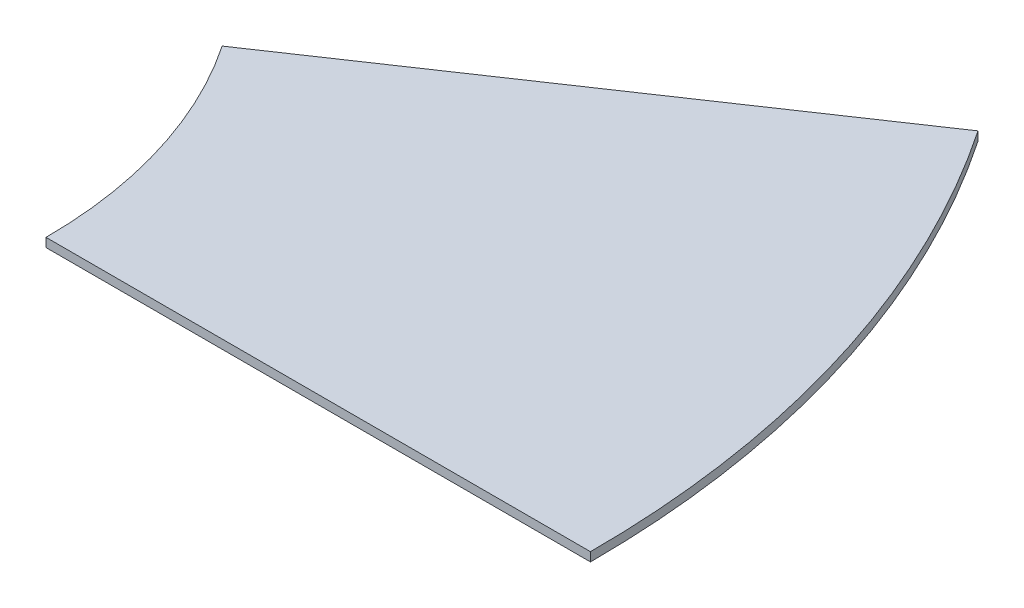
ISO-10303-21;
HEADER;
FILE_DESCRIPTION(('STEP AP214'),'2;1');
FILE_NAME('part.step','',(''),(''),'','','');
FILE_SCHEMA(('AUTOMOTIVE_DESIGN { 1 0 10303 214 1 1 1 1 }'));
ENDSEC;
DATA;
#1=APPLICATION_CONTEXT('core data for automotive mechanical design processes');
#2=APPLICATION_PROTOCOL_DEFINITION('international standard','automotive_design',2000,#1);
#3=PRODUCT_CONTEXT('',#1,'mechanical');
#4=PRODUCT('Part','Part','',(#3));
#5=PRODUCT_RELATED_PRODUCT_CATEGORY('part','',(#4));
#6=PRODUCT_DEFINITION_FORMATION('','',#4);
#7=PRODUCT_DEFINITION_CONTEXT('part definition',#1,'design');
#8=PRODUCT_DEFINITION('design','',#6,#7);
#9=PRODUCT_DEFINITION_SHAPE('','',#8);
#10=(LENGTH_UNIT() NAMED_UNIT(*) SI_UNIT(.MILLI.,.METRE.));
#11=(NAMED_UNIT(*) PLANE_ANGLE_UNIT() SI_UNIT($,.RADIAN.));
#12=(NAMED_UNIT(*) SI_UNIT($,.STERADIAN.) SOLID_ANGLE_UNIT());
#13=UNCERTAINTY_MEASURE_WITH_UNIT(LENGTH_MEASURE(1.E-05),#10,'distance_accuracy_value','');
#14=(GEOMETRIC_REPRESENTATION_CONTEXT(3) GLOBAL_UNCERTAINTY_ASSIGNED_CONTEXT((#13)) GLOBAL_UNIT_ASSIGNED_CONTEXT((#10,
#11,#12)) REPRESENTATION_CONTEXT('',''));
#15=CARTESIAN_POINT('',(0.,0.,0.));
#16=DIRECTION('',(0.,0.,1.));
#17=DIRECTION('',(1.,0.,0.));
#18=AXIS2_PLACEMENT_3D('',#15,#16,#17);
#19=CARTESIAN_POINT('',(0.,0.98,0.));
#20=DIRECTION('',(0.,-1.,0.));
#21=DIRECTION('',(0.,0.,-1.));
#22=AXIS2_PLACEMENT_3D('',#19,#20,#21);
#23=CYLINDRICAL_SURFACE('',#22,110.);
#24=CARTESIAN_POINT('',(0.,0.,0.));
#25=DIRECTION('',(0.,1.,0.));
#26=DIRECTION('',(0.,0.,1.));
#27=AXIS2_PLACEMENT_3D('',#24,#25,#26);
#28=CIRCLE('',#27,110.);
#29=CARTESIAN_POINT('',(110.,0.,0.));
#30=VERTEX_POINT('',#29);
#31=CARTESIAN_POINT('',(91.1941329810549,0.,-61.5112193817816));
#32=VERTEX_POINT('',#31);
#33=EDGE_CURVE('E97',#30,#32,#28,.T.);
#34=ORIENTED_EDGE('',*,*,#33,.T.);
#35=DIRECTION('',(0.,-1.,0.));
#36=VECTOR('',#35,1.);
#37=CARTESIAN_POINT('',(91.1941329810549,0.98,-61.5112193817816));
#38=LINE('',#37,#36);
#39=CARTESIAN_POINT('',(91.1941329810549,0.98,-61.5112193817816));
#40=VERTEX_POINT('',#39);
#41=EDGE_CURVE('E11',#40,#32,#38,.T.);
#42=ORIENTED_EDGE('',*,*,#41,.F.);
#43=CARTESIAN_POINT('',(0.,0.98,0.));
#44=DIRECTION('',(0.,1.,0.));
#45=DIRECTION('',(0.,0.,1.));
#46=AXIS2_PLACEMENT_3D('',#43,#44,#45);
#47=CIRCLE('',#46,110.);
#48=CARTESIAN_POINT('',(110.,0.98,0.));
#49=VERTEX_POINT('',#48);
#50=EDGE_CURVE('E83',#49,#40,#47,.T.);
#51=ORIENTED_EDGE('',*,*,#50,.F.);
#52=DIRECTION('',(0.,-1.,0.));
#53=VECTOR('',#52,1.);
#54=CARTESIAN_POINT('',(110.,0.98,0.));
#55=LINE('',#54,#53);
#56=EDGE_CURVE('E50',#49,#30,#55,.T.);
#57=ORIENTED_EDGE('',*,*,#56,.T.);
#58=EDGE_LOOP('',(#34,#42,#51,#57));
#59=FACE_BOUND('',#58,.T.);
#60=ADVANCED_FACE('F34',(#59),#23,.T.);
#61=CARTESIAN_POINT('',(91.1941329810549,0.98,-61.5112193817816));
#62=DIRECTION('',(0.559192903470742,0.,0.829037572555045));
#63=DIRECTION('',(0.829037572555045,0.,-0.559192903470742));
#64=AXIS2_PLACEMENT_3D('',#61,#62,#63);
#65=PLANE('',#64);
#66=DIRECTION('',(-0.829037572555045,0.,0.559192903470742));
#67=VECTOR('',#66,1.);
#68=CARTESIAN_POINT('',(91.1941329810549,0.,-61.5112193817816));
#69=LINE('',#68,#67);
#70=CARTESIAN_POINT('',(41.4518786277522,0.,-27.9596451735371));
#71=VERTEX_POINT('',#70);
#72=EDGE_CURVE('E88',#32,#71,#69,.T.);
#73=ORIENTED_EDGE('',*,*,#72,.T.);
#74=DIRECTION('',(0.,-1.,0.));
#75=VECTOR('',#74,1.);
#76=CARTESIAN_POINT('',(41.4518786277522,0.98,-27.9596451735371));
#77=LINE('',#76,#75);
#78=CARTESIAN_POINT('',(41.4518786277522,0.98,-27.9596451735371));
#79=VERTEX_POINT('',#78);
#80=EDGE_CURVE('E42',#79,#71,#77,.T.);
#81=ORIENTED_EDGE('',*,*,#80,.F.);
#82=DIRECTION('',(-0.829037572555045,0.,0.559192903470742));
#83=VECTOR('',#82,1.);
#84=CARTESIAN_POINT('',(91.1941329810549,0.98,-61.5112193817816));
#85=LINE('',#84,#83);
#86=EDGE_CURVE('E75',#40,#79,#85,.T.);
#87=ORIENTED_EDGE('',*,*,#86,.F.);
#88=ORIENTED_EDGE('',*,*,#41,.T.);
#89=EDGE_LOOP('',(#73,#81,#87,#88));
#90=FACE_BOUND('',#89,.T.);
#91=ADVANCED_FACE('F87',(#90),#65,.F.);
#92=CARTESIAN_POINT('',(0.,0.98,0.));
#93=DIRECTION('',(0.,-1.,0.));
#94=DIRECTION('',(0.,0.,-1.));
#95=AXIS2_PLACEMENT_3D('',#92,#93,#94);
#96=CYLINDRICAL_SURFACE('',#95,50.);
#97=CARTESIAN_POINT('',(0.,0.,0.));
#98=DIRECTION('',(0.,1.,0.));
#99=DIRECTION('',(0.,0.,1.));
#100=AXIS2_PLACEMENT_3D('',#97,#98,#99);
#101=CIRCLE('',#100,50.);
#102=CARTESIAN_POINT('',(50.,0.,0.));
#103=VERTEX_POINT('',#102);
#104=EDGE_CURVE('E100',#103,#71,#101,.T.);
#105=ORIENTED_EDGE('',*,*,#104,.F.);
#106=DIRECTION('',(0.,-1.,0.));
#107=VECTOR('',#106,1.);
#108=CARTESIAN_POINT('',(50.,0.98,0.));
#109=LINE('',#108,#107);
#110=CARTESIAN_POINT('',(50.,0.98,0.));
#111=VERTEX_POINT('',#110);
#112=EDGE_CURVE('E64',#111,#103,#109,.T.);
#113=ORIENTED_EDGE('',*,*,#112,.F.);
#114=CARTESIAN_POINT('',(0.,0.98,0.));
#115=DIRECTION('',(0.,1.,0.));
#116=DIRECTION('',(0.,0.,1.));
#117=AXIS2_PLACEMENT_3D('',#114,#115,#116);
#118=CIRCLE('',#117,50.);
#119=EDGE_CURVE('E82',#111,#79,#118,.T.);
#120=ORIENTED_EDGE('',*,*,#119,.T.);
#121=ORIENTED_EDGE('',*,*,#80,.T.);
#122=EDGE_LOOP('',(#105,#113,#120,#121));
#123=FACE_BOUND('',#122,.T.);
#124=ADVANCED_FACE('F91',(#123),#96,.F.);
#125=CARTESIAN_POINT('',(110.,0.98,0.));
#126=DIRECTION('',(0.,0.,1.));
#127=DIRECTION('',(1.,0.,0.));
#128=AXIS2_PLACEMENT_3D('',#125,#126,#127);
#129=PLANE('',#128);
#130=DIRECTION('',(-1.,0.,0.));
#131=VECTOR('',#130,1.);
#132=CARTESIAN_POINT('',(110.,0.,0.));
#133=LINE('',#132,#131);
#134=EDGE_CURVE('E102',#30,#103,#133,.T.);
#135=ORIENTED_EDGE('',*,*,#134,.F.);
#136=ORIENTED_EDGE('',*,*,#56,.F.);
#137=DIRECTION('',(-1.,0.,0.));
#138=VECTOR('',#137,1.);
#139=CARTESIAN_POINT('',(110.,0.98,0.));
#140=LINE('',#139,#138);
#141=EDGE_CURVE('E92',#49,#111,#140,.T.);
#142=ORIENTED_EDGE('',*,*,#141,.T.);
#143=ORIENTED_EDGE('',*,*,#112,.T.);
#144=EDGE_LOOP('',(#135,#136,#142,#143));
#145=FACE_BOUND('',#144,.T.);
#146=ADVANCED_FACE('F108',(#145),#129,.T.);
#147=CARTESIAN_POINT('',(0.,0.98,0.));
#148=DIRECTION('',(0.,1.,0.));
#149=DIRECTION('',(0.,0.,1.));
#150=AXIS2_PLACEMENT_3D('',#147,#148,#149);
#151=PLANE('',#150);
#152=ORIENTED_EDGE('',*,*,#50,.T.);
#153=ORIENTED_EDGE('',*,*,#86,.T.);
#154=ORIENTED_EDGE('',*,*,#119,.F.);
#155=ORIENTED_EDGE('',*,*,#141,.F.);
#156=EDGE_LOOP('',(#152,#153,#154,#155));
#157=FACE_BOUND('',#156,.T.);
#158=ADVANCED_FACE('F79',(#157),#151,.T.);
#159=CARTESIAN_POINT('',(0.,0.,0.));
#160=DIRECTION('',(0.,1.,0.));
#161=DIRECTION('',(0.,0.,1.));
#162=AXIS2_PLACEMENT_3D('',#159,#160,#161);
#163=PLANE('',#162);
#164=ORIENTED_EDGE('',*,*,#33,.F.);
#165=ORIENTED_EDGE('',*,*,#134,.T.);
#166=ORIENTED_EDGE('',*,*,#104,.T.);
#167=ORIENTED_EDGE('',*,*,#72,.F.);
#168=EDGE_LOOP('',(#164,#165,#166,#167));
#169=FACE_BOUND('',#168,.T.);
#170=ADVANCED_FACE('F107',(#169),#163,.F.);
#171=CLOSED_SHELL('',(#60,#91,#124,#146,#158,#170));
#172=MANIFOLD_SOLID_BREP('B2',#171);
#173=ADVANCED_BREP_SHAPE_REPRESENTATION('',(#18,#172),#14);
#174=SHAPE_DEFINITION_REPRESENTATION(#9,#173);
ENDSEC;
END-ISO-10303-21;
